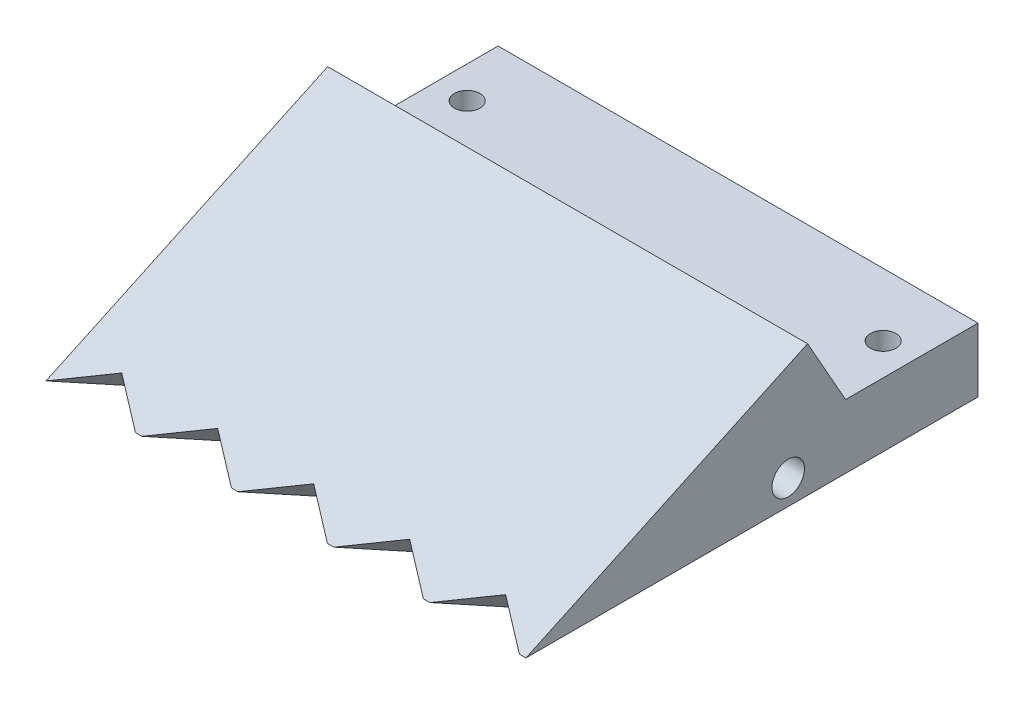
ISO-10303-21;
HEADER;
FILE_DESCRIPTION(('STEP AP214'),'2;1');
FILE_NAME('part.step','',(''),(''),'','','');
FILE_SCHEMA(('AUTOMOTIVE_DESIGN { 1 0 10303 214 1 1 1 1 }'));
ENDSEC;
DATA;
#1=APPLICATION_CONTEXT('core data for automotive mechanical design processes');
#2=APPLICATION_PROTOCOL_DEFINITION('international standard','automotive_design',2000,#1);
#3=PRODUCT_CONTEXT('',#1,'mechanical');
#4=PRODUCT('Part','Part','',(#3));
#5=PRODUCT_RELATED_PRODUCT_CATEGORY('part','',(#4));
#6=PRODUCT_DEFINITION_FORMATION('','',#4);
#7=PRODUCT_DEFINITION_CONTEXT('part definition',#1,'design');
#8=PRODUCT_DEFINITION('design','',#6,#7);
#9=PRODUCT_DEFINITION_SHAPE('','',#8);
#10=(LENGTH_UNIT() NAMED_UNIT(*) SI_UNIT(.MILLI.,.METRE.));
#11=(NAMED_UNIT(*) PLANE_ANGLE_UNIT() SI_UNIT($,.RADIAN.));
#12=(NAMED_UNIT(*) SI_UNIT($,.STERADIAN.) SOLID_ANGLE_UNIT());
#13=UNCERTAINTY_MEASURE_WITH_UNIT(LENGTH_MEASURE(1.E-05),#10,'distance_accuracy_value','');
#14=(GEOMETRIC_REPRESENTATION_CONTEXT(3) GLOBAL_UNCERTAINTY_ASSIGNED_CONTEXT((#13)) GLOBAL_UNIT_ASSIGNED_CONTEXT((#10,
#11,#12)) REPRESENTATION_CONTEXT('',''));
#15=CARTESIAN_POINT('',(0.,0.,0.));
#16=DIRECTION('',(0.,0.,1.));
#17=DIRECTION('',(1.,0.,0.));
#18=AXIS2_PLACEMENT_3D('',#15,#16,#17);
#19=CARTESIAN_POINT('',(75.,24.6994464564003,-8.57109619459907));
#20=DIRECTION('',(0.,-0.906307787036653,-0.422618261740694));
#21=DIRECTION('',(0.,0.422618261740694,-0.906307787036653));
#22=AXIS2_PLACEMENT_3D('',#19,#20,#21);
#23=PLANE('',#22);
#24=DIRECTION('',(0.,-0.422618261740694,0.906307787036653));
#25=VECTOR('',#24,1.);
#26=CARTESIAN_POINT('',(0.,24.6994464564003,-8.57109619459907));
#27=LINE('',#26,#25);
#28=CARTESIAN_POINT('',(0.,24.6994464564003,-8.57109619459907));
#29=VERTEX_POINT('',#28);
#30=CARTESIAN_POINT('',(0.,4.17318887122065,35.4476052489812));
#31=VERTEX_POINT('',#30);
#32=EDGE_CURVE('E220',#29,#31,#27,.T.);
#33=ORIENTED_EDGE('',*,*,#32,.T.);
#34=DIRECTION('',(-0.802159031205732,-0.25234978014748,0.541165849915346));
#35=VECTOR('',#34,1.);
#36=CARTESIAN_POINT('',(0.,4.17318887122065,35.4476052489812));
#37=LINE('',#36,#35);
#38=CARTESIAN_POINT('',(7.06585008190916,6.39602205686052,30.6807240992381));
#39=VERTEX_POINT('',#38);
#40=EDGE_CURVE('E152',#39,#31,#37,.T.);
#41=ORIENTED_EDGE('',*,*,#40,.F.);
#42=DIRECTION('',(-0.795744215045441,0.255951500653194,-0.548889764465591));
#43=VECTOR('',#42,1.);
#44=CARTESIAN_POINT('',(7.06585008190916,6.39602205686052,30.6807240992381));
#45=LINE('',#44,#43);
#46=CARTESIAN_POINT('',(13.9765602905617,4.17318887122065,35.4476052489812));
#47=VERTEX_POINT('',#46);
#48=EDGE_CURVE('E139',#47,#39,#45,.T.);
#49=ORIENTED_EDGE('',*,*,#48,.F.);
#50=DIRECTION('',(-1.,0.,0.));
#51=VECTOR('',#50,1.);
#52=CARTESIAN_POINT('',(75.,4.17318887122065,35.4476052489812));
#53=LINE('',#52,#51);
#54=CARTESIAN_POINT('',(15.,4.17318887122073,35.447605248981));
#55=VERTEX_POINT('',#54);
#56=EDGE_CURVE('E151',#55,#47,#53,.T.);
#57=ORIENTED_EDGE('',*,*,#56,.F.);
#58=DIRECTION('',(-0.802159031205732,-0.252349780147481,0.541165849915346));
#59=VECTOR('',#58,1.);
#60=CARTESIAN_POINT('',(15.,4.17318887122073,35.447605248981));
#61=LINE('',#60,#59);
#62=CARTESIAN_POINT('',(22.0658500819091,6.39602205686061,30.6807240992379));
#63=VERTEX_POINT('',#62);
#64=EDGE_CURVE('E380',#63,#55,#61,.T.);
#65=ORIENTED_EDGE('',*,*,#64,.F.);
#66=DIRECTION('',(-0.795744215045442,0.255951500653195,-0.548889764465591));
#67=VECTOR('',#66,1.);
#68=CARTESIAN_POINT('',(22.0658500819091,6.39602205686061,30.6807240992379));
#69=LINE('',#68,#67);
#70=CARTESIAN_POINT('',(28.9765602905617,4.17318887122073,35.447605248981));
#71=VERTEX_POINT('',#70);
#72=EDGE_CURVE('E204',#71,#63,#69,.T.);
#73=ORIENTED_EDGE('',*,*,#72,.F.);
#74=CARTESIAN_POINT('',(30.,4.17318887122082,35.4476052489808));
#75=VERTEX_POINT('',#74);
#76=EDGE_CURVE('E157',#75,#71,#53,.T.);
#77=ORIENTED_EDGE('',*,*,#76,.F.);
#78=DIRECTION('',(-0.802159031205732,-0.25234978014748,0.541165849915346));
#79=VECTOR('',#78,1.);
#80=CARTESIAN_POINT('',(30.,4.17318887122082,35.4476052489808));
#81=LINE('',#80,#79);
#82=CARTESIAN_POINT('',(37.0658500819091,6.3960220568607,30.6807240992377));
#83=VERTEX_POINT('',#82);
#84=EDGE_CURVE('E193',#83,#75,#81,.T.);
#85=ORIENTED_EDGE('',*,*,#84,.F.);
#86=DIRECTION('',(-0.795744215045442,0.255951500653194,-0.548889764465591));
#87=VECTOR('',#86,1.);
#88=CARTESIAN_POINT('',(37.0658500819091,6.3960220568607,30.6807240992377));
#89=LINE('',#88,#87);
#90=CARTESIAN_POINT('',(43.9765602905617,4.17318887122082,35.4476052489808));
#91=VERTEX_POINT('',#90);
#92=EDGE_CURVE('E191',#91,#83,#89,.T.);
#93=ORIENTED_EDGE('',*,*,#92,.F.);
#94=CARTESIAN_POINT('',(45.,4.17318887122091,35.4476052489806));
#95=VERTEX_POINT('',#94);
#96=EDGE_CURVE('E162',#95,#91,#53,.T.);
#97=ORIENTED_EDGE('',*,*,#96,.F.);
#98=DIRECTION('',(-0.802159031205732,-0.25234978014748,0.541165849915346));
#99=VECTOR('',#98,1.);
#100=CARTESIAN_POINT('',(45.,4.17318887122091,35.4476052489806));
#101=LINE('',#100,#99);
#102=CARTESIAN_POINT('',(52.0658500819091,6.39602205686078,30.6807240992375));
#103=VERTEX_POINT('',#102);
#104=EDGE_CURVE('E188',#103,#95,#101,.T.);
#105=ORIENTED_EDGE('',*,*,#104,.F.);
#106=DIRECTION('',(-0.795744215045442,0.255951500653194,-0.548889764465591));
#107=VECTOR('',#106,1.);
#108=CARTESIAN_POINT('',(52.0658500819091,6.39602205686078,30.6807240992375));
#109=LINE('',#108,#107);
#110=CARTESIAN_POINT('',(58.9765602905616,4.17318887122091,35.4476052489806));
#111=VERTEX_POINT('',#110);
#112=EDGE_CURVE('E205',#111,#103,#109,.T.);
#113=ORIENTED_EDGE('',*,*,#112,.F.);
#114=CARTESIAN_POINT('',(60.,4.173188871221,35.4476052489804));
#115=VERTEX_POINT('',#114);
#116=EDGE_CURVE('E169',#115,#111,#53,.T.);
#117=ORIENTED_EDGE('',*,*,#116,.F.);
#118=DIRECTION('',(-0.802159031205732,-0.25234978014748,0.541165849915346));
#119=VECTOR('',#118,1.);
#120=CARTESIAN_POINT('',(60.,4.173188871221,35.4476052489804));
#121=LINE('',#120,#119);
#122=CARTESIAN_POINT('',(67.0658500819091,6.39602205686087,30.6807240992373));
#123=VERTEX_POINT('',#122);
#124=EDGE_CURVE('E213',#123,#115,#121,.T.);
#125=ORIENTED_EDGE('',*,*,#124,.F.);
#126=DIRECTION('',(-0.795744215045442,0.255951500653194,-0.548889764465591));
#127=VECTOR('',#126,1.);
#128=CARTESIAN_POINT('',(67.0658500819091,6.39602205686087,30.6807240992373));
#129=LINE('',#128,#127);
#130=CARTESIAN_POINT('',(73.9765602905616,4.173188871221,35.4476052489804));
#131=VERTEX_POINT('',#130);
#132=EDGE_CURVE('E210',#131,#123,#129,.T.);
#133=ORIENTED_EDGE('',*,*,#132,.F.);
#134=CARTESIAN_POINT('',(75.,4.17318887122065,35.4476052489812));
#135=VERTEX_POINT('',#134);
#136=EDGE_CURVE('E160',#135,#131,#53,.T.);
#137=ORIENTED_EDGE('',*,*,#136,.F.);
#138=DIRECTION('',(0.,-0.422618261740694,0.906307787036653));
#139=VECTOR('',#138,1.);
#140=CARTESIAN_POINT('',(75.,24.6994464564003,-8.57109619459907));
#141=LINE('',#140,#139);
#142=CARTESIAN_POINT('',(75.,24.6994464564003,-8.57109619459907));
#143=VERTEX_POINT('',#142);
#144=EDGE_CURVE('E224',#143,#135,#141,.T.);
#145=ORIENTED_EDGE('',*,*,#144,.F.);
#146=DIRECTION('',(-1.,0.,0.));
#147=VECTOR('',#146,1.);
#148=CARTESIAN_POINT('',(75.,24.6994464564003,-8.57109619459907));
#149=LINE('',#148,#147);
#150=EDGE_CURVE('E236',#143,#29,#149,.T.);
#151=ORIENTED_EDGE('',*,*,#150,.T.);
#152=EDGE_LOOP('',(#33,#41,#49,#57,#65,#73,#77,#85,#93,#97,#105,#113,#117,#125,#133,#137,#145,#151));
#153=FACE_BOUND('',#152,.T.);
#154=ADVANCED_FACE('F34',(#153),#23,.F.);
#155=CARTESIAN_POINT('',(75.,4.17318887122065,35.4476052489812));
#156=DIRECTION('',(0.,1.,0.));
#157=DIRECTION('',(0.,0.,1.));
#158=AXIS2_PLACEMENT_3D('',#155,#156,#157);
#159=PLANE('',#158);
#160=CARTESIAN_POINT('',(69.9999989548679,4.17318887122065,-25.3862154796132));
#161=DIRECTION('',(0.,1.,0.));
#162=DIRECTION('',(0.,0.,1.));
#163=AXIS2_PLACEMENT_3D('',#160,#161,#162);
#164=CIRCLE('',#163,3.99999999999999);
#165=CARTESIAN_POINT('',(69.9999989548679,4.17318887122065,-21.3862154796132));
#166=VERTEX_POINT('',#165);
#167=EDGE_CURVE('E279',#166,#166,#164,.T.);
#168=ORIENTED_EDGE('',*,*,#167,.T.);
#169=EDGE_LOOP('',(#168));
#170=FACE_BOUND('',#169,.T.);
#171=CARTESIAN_POINT('',(5.,4.17318887122065,-25.3745592722076));
#172=DIRECTION('',(0.,1.,0.));
#173=DIRECTION('',(0.,0.,1.));
#174=AXIS2_PLACEMENT_3D('',#171,#172,#173);
#175=CIRCLE('',#174,3.99999999999999);
#176=CARTESIAN_POINT('',(5.,4.17318887122065,-21.3745592722076));
#177=VERTEX_POINT('',#176);
#178=EDGE_CURVE('E276',#177,#177,#175,.T.);
#179=ORIENTED_EDGE('',*,*,#178,.T.);
#180=EDGE_LOOP('',(#179));
#181=FACE_BOUND('',#180,.T.);
#182=DIRECTION('',(-0.765791701632656,0.,-0.643088695057347));
#183=VECTOR('',#182,1.);
#184=CARTESIAN_POINT('',(49.7629589494673,4.17318887122065,65.4999398006517));
#185=LINE('',#184,#183);
#186=CARTESIAN_POINT('',(7.06585008190916,4.17318887122065,29.6441999619731));
#187=VERTEX_POINT('',#186);
#188=EDGE_CURVE('E136',#47,#187,#185,.T.);
#189=ORIENTED_EDGE('',*,*,#188,.T.);
#190=DIRECTION('',(-0.772763043523777,0.,0.634694634106724));
#191=VECTOR('',#190,1.);
#192=CARTESIAN_POINT('',(44.7872041077098,4.17318887122065,-1.33753653805802));
#193=LINE('',#192,#191);
#194=EDGE_CURVE('E144',#187,#31,#193,.T.);
#195=ORIENTED_EDGE('',*,*,#194,.T.);
#196=DIRECTION('',(0.,0.,-1.));
#197=VECTOR('',#196,1.);
#198=CARTESIAN_POINT('',(0.,4.17318887122065,35.4476052489812));
#199=LINE('',#198,#197);
#200=CARTESIAN_POINT('',(0.,4.17318887122065,-35.2064814814815));
#201=VERTEX_POINT('',#200);
#202=EDGE_CURVE('E238',#31,#201,#199,.T.);
#203=ORIENTED_EDGE('',*,*,#202,.T.);
#204=DIRECTION('',(-1.,0.,0.));
#205=VECTOR('',#204,1.);
#206=CARTESIAN_POINT('',(75.,4.17318887122065,-35.2064814814815));
#207=LINE('',#206,#205);
#208=CARTESIAN_POINT('',(75.,4.17318887122065,-35.2064814814815));
#209=VERTEX_POINT('',#208);
#210=EDGE_CURVE('E158',#209,#201,#207,.T.);
#211=ORIENTED_EDGE('',*,*,#210,.F.);
#212=DIRECTION('',(0.,0.,-1.));
#213=VECTOR('',#212,1.);
#214=CARTESIAN_POINT('',(75.,4.17318887122065,35.4476052489812));
#215=LINE('',#214,#213);
#216=EDGE_CURVE('E227',#135,#209,#215,.T.);
#217=ORIENTED_EDGE('',*,*,#216,.F.);
#218=ORIENTED_EDGE('',*,*,#136,.T.);
#219=DIRECTION('',(-0.765791701632656,0.,-0.643088695057347));
#220=VECTOR('',#219,1.);
#221=CARTESIAN_POINT('',(74.5767431321014,4.17318887122065,35.9516206353298));
#222=LINE('',#221,#220);
#223=CARTESIAN_POINT('',(67.0658500819091,4.17318887122065,29.6441999619722));
#224=VERTEX_POINT('',#223);
#225=EDGE_CURVE('E168',#131,#224,#222,.T.);
#226=ORIENTED_EDGE('',*,*,#225,.T.);
#227=DIRECTION('',(-0.772763043523777,0.,0.634694634106724));
#228=VECTOR('',#227,1.);
#229=CARTESIAN_POINT('',(68.9574408215415,4.17318887122065,28.0905768915728));
#230=LINE('',#229,#228);
#231=EDGE_CURVE('E172',#224,#115,#230,.T.);
#232=ORIENTED_EDGE('',*,*,#231,.T.);
#233=ORIENTED_EDGE('',*,*,#116,.T.);
#234=DIRECTION('',(-0.765791701632656,0.,-0.643088695057347));
#235=VECTOR('',#234,1.);
#236=CARTESIAN_POINT('',(68.3732970864429,4.17318887122065,43.3387004266603));
#237=LINE('',#236,#235);
#238=CARTESIAN_POINT('',(52.0658500819091,4.17318887122065,29.6441999619725));
#239=VERTEX_POINT('',#238);
#240=EDGE_CURVE('E390',#111,#239,#237,.T.);
#241=ORIENTED_EDGE('',*,*,#240,.T.);
#242=DIRECTION('',(-0.772763043523777,0.,0.634694634106724));
#243=VECTOR('',#242,1.);
#244=CARTESIAN_POINT('',(62.9148816430836,4.17318887122065,20.7335485341651));
#245=LINE('',#244,#243);
#246=EDGE_CURVE('E184',#239,#95,#245,.T.);
#247=ORIENTED_EDGE('',*,*,#246,.T.);
#248=ORIENTED_EDGE('',*,*,#96,.T.);
#249=DIRECTION('',(-0.765791701632656,0.,-0.643088695057347));
#250=VECTOR('',#249,1.);
#251=CARTESIAN_POINT('',(62.1698510407844,4.17318887122065,50.7257802179907));
#252=LINE('',#251,#250);
#253=CARTESIAN_POINT('',(37.0658500819091,4.17318887122065,29.6441999619727));
#254=VERTEX_POINT('',#253);
#255=EDGE_CURVE('E182',#91,#254,#252,.T.);
#256=ORIENTED_EDGE('',*,*,#255,.T.);
#257=DIRECTION('',(-0.772763043523777,0.,0.634694634106724));
#258=VECTOR('',#257,1.);
#259=CARTESIAN_POINT('',(56.8723224646257,4.17318887122065,13.3765201767574));
#260=LINE('',#259,#258);
#261=EDGE_CURVE('E384',#254,#75,#260,.T.);
#262=ORIENTED_EDGE('',*,*,#261,.T.);
#263=ORIENTED_EDGE('',*,*,#76,.T.);
#264=DIRECTION('',(-0.765791701632656,0.,-0.643088695057347));
#265=VECTOR('',#264,1.);
#266=CARTESIAN_POINT('',(55.9664049951259,4.17318887122065,58.1128600093212));
#267=LINE('',#266,#265);
#268=CARTESIAN_POINT('',(22.0658500819091,4.17318887122065,29.6441999619729));
#269=VERTEX_POINT('',#268);
#270=EDGE_CURVE('E382',#71,#269,#267,.T.);
#271=ORIENTED_EDGE('',*,*,#270,.T.);
#272=DIRECTION('',(-0.772763043523778,0.,0.634694634106724));
#273=VECTOR('',#272,1.);
#274=CARTESIAN_POINT('',(50.8297632861678,4.17318887122065,6.01949181934968));
#275=LINE('',#274,#273);
#276=EDGE_CURVE('E145',#269,#55,#275,.T.);
#277=ORIENTED_EDGE('',*,*,#276,.T.);
#278=ORIENTED_EDGE('',*,*,#56,.T.);
#279=EDGE_LOOP('',(#189,#195,#203,#211,#217,#218,#226,#232,#233,#241,#247,#248,#256,#262,#263,
#271,#277,#278));
#280=FACE_BOUND('',#279,.T.);
#281=ADVANCED_FACE('F155',(#170,#181,#280),#159,.F.);
#282=CARTESIAN_POINT('',(75.,4.17318887122065,-35.2064814814815));
#283=DIRECTION('',(0.,0.,1.));
#284=DIRECTION('',(1.,0.,0.));
#285=AXIS2_PLACEMENT_3D('',#282,#283,#284);
#286=PLANE('',#285);
#287=DIRECTION('',(0.,1.,0.));
#288=VECTOR('',#287,1.);
#289=CARTESIAN_POINT('',(0.,4.17318887122065,-35.2064814814815));
#290=LINE('',#289,#288);
#291=CARTESIAN_POINT('',(0.,14.1731888712206,-35.2064814814815));
#292=VERTEX_POINT('',#291);
#293=EDGE_CURVE('E240',#201,#292,#290,.T.);
#294=ORIENTED_EDGE('',*,*,#293,.T.);
#295=DIRECTION('',(-1.,0.,0.));
#296=VECTOR('',#295,1.);
#297=CARTESIAN_POINT('',(75.,14.1731888712206,-35.2064814814815));
#298=LINE('',#297,#296);
#299=CARTESIAN_POINT('',(75.,14.1731888712206,-35.2064814814815));
#300=VERTEX_POINT('',#299);
#301=EDGE_CURVE('E164',#300,#292,#298,.T.);
#302=ORIENTED_EDGE('',*,*,#301,.F.);
#303=DIRECTION('',(0.,1.,0.));
#304=VECTOR('',#303,1.);
#305=CARTESIAN_POINT('',(75.,4.17318887122065,-35.2064814814815));
#306=LINE('',#305,#304);
#307=EDGE_CURVE('E230',#209,#300,#306,.T.);
#308=ORIENTED_EDGE('',*,*,#307,.F.);
#309=ORIENTED_EDGE('',*,*,#210,.T.);
#310=EDGE_LOOP('',(#294,#302,#308,#309));
#311=FACE_BOUND('',#310,.T.);
#312=ADVANCED_FACE('F274',(#311),#286,.F.);
#313=CARTESIAN_POINT('',(75.,14.1731888712206,-35.2064814814815));
#314=DIRECTION('',(0.,-1.,0.));
#315=DIRECTION('',(0.,0.,-1.));
#316=AXIS2_PLACEMENT_3D('',#313,#314,#315);
#317=PLANE('',#316);
#318=CARTESIAN_POINT('',(5.,14.1731888712206,-25.3745592722076));
#319=DIRECTION('',(0.,1.,0.));
#320=DIRECTION('',(0.,0.,1.));
#321=AXIS2_PLACEMENT_3D('',#318,#319,#320);
#322=CIRCLE('',#321,2.);
#323=CARTESIAN_POINT('',(5.,14.1731888712206,-23.3745592722076));
#324=VERTEX_POINT('',#323);
#325=EDGE_CURVE('E217',#324,#324,#322,.T.);
#326=ORIENTED_EDGE('',*,*,#325,.F.);
#327=EDGE_LOOP('',(#326));
#328=FACE_BOUND('',#327,.T.);
#329=CARTESIAN_POINT('',(69.9999989548679,14.1731888712206,-25.3862154796132));
#330=DIRECTION('',(0.,1.,0.));
#331=DIRECTION('',(0.,0.,1.));
#332=AXIS2_PLACEMENT_3D('',#329,#330,#331);
#333=CIRCLE('',#332,2.);
#334=CARTESIAN_POINT('',(69.9999989548679,14.1731888712206,-23.3862154796132));
#335=VERTEX_POINT('',#334);
#336=EDGE_CURVE('E221',#335,#335,#333,.T.);
#337=ORIENTED_EDGE('',*,*,#336,.F.);
#338=EDGE_LOOP('',(#337));
#339=FACE_BOUND('',#338,.T.);
#340=DIRECTION('',(0.,0.,1.));
#341=VECTOR('',#340,1.);
#342=CARTESIAN_POINT('',(0.,14.1731888712206,-35.2064814814815));
#343=LINE('',#342,#341);
#344=CARTESIAN_POINT('',(0.,14.1731888712206,-14.5119108644451));
#345=VERTEX_POINT('',#344);
#346=EDGE_CURVE('E242',#292,#345,#343,.T.);
#347=ORIENTED_EDGE('',*,*,#346,.T.);
#348=DIRECTION('',(-1.,0.,0.));
#349=VECTOR('',#348,1.);
#350=CARTESIAN_POINT('',(75.,14.1731888712206,-14.5119108644451));
#351=LINE('',#350,#349);
#352=CARTESIAN_POINT('',(75.,14.1731888712206,-14.5119108644451));
#353=VERTEX_POINT('',#352);
#354=EDGE_CURVE('E247',#353,#345,#351,.T.);
#355=ORIENTED_EDGE('',*,*,#354,.F.);
#356=DIRECTION('',(0.,0.,1.));
#357=VECTOR('',#356,1.);
#358=CARTESIAN_POINT('',(75.,14.1731888712206,-35.2064814814815));
#359=LINE('',#358,#357);
#360=EDGE_CURVE('E232',#300,#353,#359,.T.);
#361=ORIENTED_EDGE('',*,*,#360,.F.);
#362=ORIENTED_EDGE('',*,*,#301,.T.);
#363=EDGE_LOOP('',(#347,#355,#361,#362));
#364=FACE_BOUND('',#363,.T.);
#365=ADVANCED_FACE('F255',(#328,#339,#364),#317,.F.);
#366=CARTESIAN_POINT('',(75.,14.1731888712206,-14.5119108644451));
#367=DIRECTION('',(0.,-0.491504803469351,0.870874863666735));
#368=DIRECTION('',(0.,-0.870874863666736,-0.491504803469351));
#369=AXIS2_PLACEMENT_3D('',#366,#367,#368);
#370=PLANE('',#369);
#371=DIRECTION('',(0.,0.870874863666735,0.491504803469351));
#372=VECTOR('',#371,1.);
#373=CARTESIAN_POINT('',(0.,14.1731888712206,-14.5119108644451));
#374=LINE('',#373,#372);
#375=EDGE_CURVE('E228',#345,#29,#374,.T.);
#376=ORIENTED_EDGE('',*,*,#375,.T.);
#377=ORIENTED_EDGE('',*,*,#150,.F.);
#378=DIRECTION('',(0.,0.870874863666735,0.491504803469351));
#379=VECTOR('',#378,1.);
#380=CARTESIAN_POINT('',(75.,14.1731888712206,-14.5119108644451));
#381=LINE('',#380,#379);
#382=EDGE_CURVE('E234',#353,#143,#381,.T.);
#383=ORIENTED_EDGE('',*,*,#382,.F.);
#384=ORIENTED_EDGE('',*,*,#354,.T.);
#385=EDGE_LOOP('',(#376,#377,#383,#384));
#386=FACE_BOUND('',#385,.T.);
#387=ADVANCED_FACE('F267',(#386),#370,.F.);
#388=CARTESIAN_POINT('',(75.,0.,0.));
#389=DIRECTION('',(-1.,0.,0.));
#390=DIRECTION('',(0.,0.,1.));
#391=AXIS2_PLACEMENT_3D('',#388,#389,#390);
#392=PLANE('',#391);
#393=CARTESIAN_POINT('',(75.,8.033515634858,-5.54758710562415));
#394=DIRECTION('',(-1.,0.,0.));
#395=DIRECTION('',(0.,0.,1.));
#396=AXIS2_PLACEMENT_3D('',#393,#394,#395);
#397=CIRCLE('',#396,2.54300844368567);
#398=CARTESIAN_POINT('',(75.,8.033515634858,-3.00457866193848));
#399=VERTEX_POINT('',#398);
#400=EDGE_CURVE('E214',#399,#399,#397,.T.);
#401=ORIENTED_EDGE('',*,*,#400,.T.);
#402=EDGE_LOOP('',(#401));
#403=FACE_BOUND('',#402,.T.);
#404=ORIENTED_EDGE('',*,*,#144,.T.);
#405=ORIENTED_EDGE('',*,*,#216,.T.);
#406=ORIENTED_EDGE('',*,*,#307,.T.);
#407=ORIENTED_EDGE('',*,*,#360,.T.);
#408=ORIENTED_EDGE('',*,*,#382,.T.);
#409=EDGE_LOOP('',(#404,#405,#406,#407,#408));
#410=FACE_BOUND('',#409,.T.);
#411=ADVANCED_FACE('F272',(#403,#410),#392,.F.);
#412=CARTESIAN_POINT('',(0.,0.,0.));
#413=DIRECTION('',(-1.,0.,0.));
#414=DIRECTION('',(0.,0.,1.));
#415=AXIS2_PLACEMENT_3D('',#412,#413,#414);
#416=PLANE('',#415);
#417=CARTESIAN_POINT('',(0.,8.033515634858,-5.54758710562415));
#418=DIRECTION('',(-1.,0.,0.));
#419=DIRECTION('',(0.,0.,1.));
#420=AXIS2_PLACEMENT_3D('',#417,#418,#419);
#421=CIRCLE('',#420,2.54300844368567);
#422=CARTESIAN_POINT('',(0.,8.033515634858,-3.00457866193848));
#423=VERTEX_POINT('',#422);
#424=EDGE_CURVE('E372',#423,#423,#421,.T.);
#425=ORIENTED_EDGE('',*,*,#424,.F.);
#426=EDGE_LOOP('',(#425));
#427=FACE_BOUND('',#426,.T.);
#428=ORIENTED_EDGE('',*,*,#32,.F.);
#429=ORIENTED_EDGE('',*,*,#375,.F.);
#430=ORIENTED_EDGE('',*,*,#346,.F.);
#431=ORIENTED_EDGE('',*,*,#293,.F.);
#432=ORIENTED_EDGE('',*,*,#202,.F.);
#433=EDGE_LOOP('',(#428,#429,#430,#431,#432));
#434=FACE_BOUND('',#433,.T.);
#435=ADVANCED_FACE('F263',(#427,#434),#416,.T.);
#436=CARTESIAN_POINT('',(69.9999989548679,4.17318887122064,-25.3862154796132));
#437=DIRECTION('',(0.,1.,0.));
#438=DIRECTION('',(0.,0.,1.));
#439=AXIS2_PLACEMENT_3D('',#436,#437,#438);
#440=CYLINDRICAL_SURFACE('',#439,2.);
#441=CARTESIAN_POINT('',(69.9999989548679,6.17318887122064,-25.3862154796132));
#442=DIRECTION('',(0.,1.,0.));
#443=DIRECTION('',(0.,0.,1.));
#444=AXIS2_PLACEMENT_3D('',#441,#442,#443);
#445=CIRCLE('',#444,2.);
#446=CARTESIAN_POINT('',(69.9999989548679,6.17318887122064,-23.3862154796132));
#447=VERTEX_POINT('',#446);
#448=EDGE_CURVE('E42',#447,#447,#445,.F.);
#449=ORIENTED_EDGE('',*,*,#448,.T.);
#450=EDGE_LOOP('',(#449));
#451=FACE_BOUND('',#450,.T.);
#452=ORIENTED_EDGE('',*,*,#336,.T.);
#453=EDGE_LOOP('',(#452));
#454=FACE_BOUND('',#453,.T.);
#455=ADVANCED_FACE('F287',(#451,#454),#440,.F.);
#456=CARTESIAN_POINT('',(5.,4.17318887122064,-25.3745592722076));
#457=DIRECTION('',(0.,1.,0.));
#458=DIRECTION('',(0.,0.,1.));
#459=AXIS2_PLACEMENT_3D('',#456,#457,#458);
#460=CYLINDRICAL_SURFACE('',#459,2.);
#461=CARTESIAN_POINT('',(5.,6.17318887122064,-25.3745592722076));
#462=DIRECTION('',(0.,1.,0.));
#463=DIRECTION('',(0.,0.,1.));
#464=AXIS2_PLACEMENT_3D('',#461,#462,#463);
#465=CIRCLE('',#464,2.);
#466=CARTESIAN_POINT('',(5.,6.17318887122064,-23.3745592722076));
#467=VERTEX_POINT('',#466);
#468=EDGE_CURVE('E11',#467,#467,#465,.F.);
#469=ORIENTED_EDGE('',*,*,#468,.T.);
#470=EDGE_LOOP('',(#469));
#471=FACE_BOUND('',#470,.T.);
#472=ORIENTED_EDGE('',*,*,#325,.T.);
#473=EDGE_LOOP('',(#472));
#474=FACE_BOUND('',#473,.T.);
#475=ADVANCED_FACE('F326',(#471,#474),#460,.F.);
#476=CARTESIAN_POINT('',(60.,-4.88988899914553,31.2214226315735));
#477=DIRECTION('',(-0.597110449293161,0.339007055407765,-0.727002976423532));
#478=DIRECTION('',(-0.772763043523777,0.,0.634694634106724));
#479=AXIS2_PLACEMENT_3D('',#476,#477,#478);
#480=PLANE('',#479);
#481=DIRECTION('',(0.,0.906307787036653,0.422618261740694));
#482=VECTOR('',#481,1.);
#483=CARTESIAN_POINT('',(67.0658500819091,-2.66705581350565,26.4545414818304));
#484=LINE('',#483,#482);
#485=EDGE_CURVE('E208',#224,#123,#484,.T.);
#486=ORIENTED_EDGE('',*,*,#485,.T.);
#487=ORIENTED_EDGE('',*,*,#124,.T.);
#488=ORIENTED_EDGE('',*,*,#231,.F.);
#489=EDGE_LOOP('',(#486,#487,#488));
#490=FACE_BOUND('',#489,.T.);
#491=ADVANCED_FACE('F329',(#490),#480,.F.);
#492=CARTESIAN_POINT('',(67.0658500819091,-2.66705581350565,26.4545414818304));
#493=DIRECTION('',(0.605632846055854,0.336296036952717,-0.721189178585052));
#494=DIRECTION('',(-0.765791701632656,0.,-0.643088695057347));
#495=AXIS2_PLACEMENT_3D('',#492,#493,#494);
#496=PLANE('',#495);
#497=ORIENTED_EDGE('',*,*,#132,.T.);
#498=ORIENTED_EDGE('',*,*,#485,.F.);
#499=ORIENTED_EDGE('',*,*,#225,.F.);
#500=EDGE_LOOP('',(#497,#498,#499));
#501=FACE_BOUND('',#500,.T.);
#502=ADVANCED_FACE('F331',(#501),#496,.F.);
#503=CARTESIAN_POINT('',(45.,-4.88988899914562,31.2214226315737));
#504=DIRECTION('',(-0.597110449293161,0.339007055407765,-0.727002976423532));
#505=DIRECTION('',(-0.772763043523777,0.,0.634694634106724));
#506=AXIS2_PLACEMENT_3D('',#503,#504,#505);
#507=PLANE('',#506);
#508=DIRECTION('',(0.,0.906307787036653,0.422618261740694));
#509=VECTOR('',#508,1.);
#510=CARTESIAN_POINT('',(52.0658500819091,-2.66705581350574,26.4545414818306));
#511=LINE('',#510,#509);
#512=EDGE_CURVE('E195',#239,#103,#511,.T.);
#513=ORIENTED_EDGE('',*,*,#512,.T.);
#514=ORIENTED_EDGE('',*,*,#104,.T.);
#515=ORIENTED_EDGE('',*,*,#246,.F.);
#516=EDGE_LOOP('',(#513,#514,#515));
#517=FACE_BOUND('',#516,.T.);
#518=ADVANCED_FACE('F334',(#517),#507,.F.);
#519=CARTESIAN_POINT('',(52.0658500819091,-2.66705581350574,26.4545414818306));
#520=DIRECTION('',(0.605632846055854,0.336296036952717,-0.721189178585052));
#521=DIRECTION('',(-0.765791701632656,0.,-0.643088695057347));
#522=AXIS2_PLACEMENT_3D('',#519,#520,#521);
#523=PLANE('',#522);
#524=ORIENTED_EDGE('',*,*,#112,.T.);
#525=ORIENTED_EDGE('',*,*,#512,.F.);
#526=ORIENTED_EDGE('',*,*,#240,.F.);
#527=EDGE_LOOP('',(#524,#525,#526));
#528=FACE_BOUND('',#527,.T.);
#529=ADVANCED_FACE('F339',(#528),#523,.F.);
#530=CARTESIAN_POINT('',(30.,-4.88988899914571,31.2214226315739));
#531=DIRECTION('',(-0.597110449293161,0.339007055407765,-0.727002976423532));
#532=DIRECTION('',(-0.772763043523777,0.,0.634694634106724));
#533=AXIS2_PLACEMENT_3D('',#530,#531,#532);
#534=PLANE('',#533);
#535=DIRECTION('',(0.,0.906307787036653,0.422618261740694));
#536=VECTOR('',#535,1.);
#537=CARTESIAN_POINT('',(37.0658500819091,-2.66705581350583,26.4545414818308));
#538=LINE('',#537,#536);
#539=EDGE_CURVE('E197',#254,#83,#538,.T.);
#540=ORIENTED_EDGE('',*,*,#539,.T.);
#541=ORIENTED_EDGE('',*,*,#84,.T.);
#542=ORIENTED_EDGE('',*,*,#261,.F.);
#543=EDGE_LOOP('',(#540,#541,#542));
#544=FACE_BOUND('',#543,.T.);
#545=ADVANCED_FACE('F342',(#544),#534,.F.);
#546=CARTESIAN_POINT('',(37.0658500819091,-2.66705581350583,26.4545414818308));
#547=DIRECTION('',(0.605632846055854,0.336296036952717,-0.721189178585052));
#548=DIRECTION('',(-0.765791701632656,0.,-0.643088695057347));
#549=AXIS2_PLACEMENT_3D('',#546,#547,#548);
#550=PLANE('',#549);
#551=ORIENTED_EDGE('',*,*,#92,.T.);
#552=ORIENTED_EDGE('',*,*,#539,.F.);
#553=ORIENTED_EDGE('',*,*,#255,.F.);
#554=EDGE_LOOP('',(#551,#552,#553));
#555=FACE_BOUND('',#554,.T.);
#556=ADVANCED_FACE('F347',(#555),#550,.F.);
#557=CARTESIAN_POINT('',(15.,-4.8898889991458,31.221422631574));
#558=DIRECTION('',(-0.597110449293161,0.339007055407766,-0.727002976423533));
#559=DIRECTION('',(-0.772763043523778,0.,0.634694634106724));
#560=AXIS2_PLACEMENT_3D('',#557,#558,#559);
#561=PLANE('',#560);
#562=DIRECTION('',(0.,0.906307787036653,0.422618261740694));
#563=VECTOR('',#562,1.);
#564=CARTESIAN_POINT('',(22.0658500819091,-2.66705581350592,26.454541481831));
#565=LINE('',#564,#563);
#566=EDGE_CURVE('E57',#269,#63,#565,.T.);
#567=ORIENTED_EDGE('',*,*,#566,.T.);
#568=ORIENTED_EDGE('',*,*,#64,.T.);
#569=ORIENTED_EDGE('',*,*,#276,.F.);
#570=EDGE_LOOP('',(#567,#568,#569));
#571=FACE_BOUND('',#570,.T.);
#572=ADVANCED_FACE('F350',(#571),#561,.F.);
#573=CARTESIAN_POINT('',(22.0658500819091,-2.66705581350592,26.454541481831));
#574=DIRECTION('',(0.605632846055854,0.336296036952717,-0.721189178585052));
#575=DIRECTION('',(-0.765791701632656,0.,-0.643088695057347));
#576=AXIS2_PLACEMENT_3D('',#573,#574,#575);
#577=PLANE('',#576);
#578=ORIENTED_EDGE('',*,*,#72,.T.);
#579=ORIENTED_EDGE('',*,*,#566,.F.);
#580=ORIENTED_EDGE('',*,*,#270,.F.);
#581=EDGE_LOOP('',(#578,#579,#580));
#582=FACE_BOUND('',#581,.T.);
#583=ADVANCED_FACE('F354',(#582),#577,.F.);
#584=CARTESIAN_POINT('',(0.,-4.88988899914588,31.2214226315742));
#585=DIRECTION('',(-0.597110449293161,0.339007055407765,-0.727002976423532));
#586=DIRECTION('',(-0.772763043523777,0.,0.634694634106724));
#587=AXIS2_PLACEMENT_3D('',#584,#585,#586);
#588=PLANE('',#587);
#589=DIRECTION('',(0.,0.906307787036653,0.422618261740694));
#590=VECTOR('',#589,1.);
#591=CARTESIAN_POINT('',(7.06585008190916,-2.66705581350601,26.4545414818311));
#592=LINE('',#591,#590);
#593=EDGE_CURVE('E49',#187,#39,#592,.T.);
#594=ORIENTED_EDGE('',*,*,#593,.T.);
#595=ORIENTED_EDGE('',*,*,#40,.T.);
#596=ORIENTED_EDGE('',*,*,#194,.F.);
#597=EDGE_LOOP('',(#594,#595,#596));
#598=FACE_BOUND('',#597,.T.);
#599=ADVANCED_FACE('F357',(#598),#588,.F.);
#600=CARTESIAN_POINT('',(7.06585008190916,-2.66705581350601,26.4545414818311));
#601=DIRECTION('',(0.605632846055855,0.336296036952717,-0.721189178585052));
#602=DIRECTION('',(-0.765791701632656,0.,-0.643088695057347));
#603=AXIS2_PLACEMENT_3D('',#600,#601,#602);
#604=PLANE('',#603);
#605=ORIENTED_EDGE('',*,*,#48,.T.);
#606=ORIENTED_EDGE('',*,*,#593,.F.);
#607=ORIENTED_EDGE('',*,*,#188,.F.);
#608=EDGE_LOOP('',(#605,#606,#607));
#609=FACE_BOUND('',#608,.T.);
#610=ADVANCED_FACE('F138',(#609),#604,.F.);
#611=CARTESIAN_POINT('',(100.,8.033515634858,-5.54758710562415));
#612=DIRECTION('',(-1.,0.,0.));
#613=DIRECTION('',(0.,0.,1.));
#614=AXIS2_PLACEMENT_3D('',#611,#612,#613);
#615=CYLINDRICAL_SURFACE('',#614,2.54300844368567);
#616=ORIENTED_EDGE('',*,*,#424,.T.);
#617=EDGE_LOOP('',(#616));
#618=FACE_BOUND('',#617,.T.);
#619=ORIENTED_EDGE('',*,*,#400,.F.);
#620=EDGE_LOOP('',(#619));
#621=FACE_BOUND('',#620,.T.);
#622=ADVANCED_FACE('F293',(#618,#621),#615,.F.);
#623=CARTESIAN_POINT('',(69.9999989548679,4.17318887122065,-25.3862154796132));
#624=DIRECTION('',(0.,-1.,0.));
#625=DIRECTION('',(0.,0.,-1.));
#626=AXIS2_PLACEMENT_3D('',#623,#624,#625);
#627=CONICAL_SURFACE('',#626,3.99999999999999,0.785398163397447);
#628=ORIENTED_EDGE('',*,*,#448,.F.);
#629=EDGE_LOOP('',(#628));
#630=FACE_BOUND('',#629,.T.);
#631=ORIENTED_EDGE('',*,*,#167,.F.);
#632=EDGE_LOOP('',(#631));
#633=FACE_BOUND('',#632,.T.);
#634=ADVANCED_FACE('F290',(#630,#633),#627,.F.);
#635=CARTESIAN_POINT('',(5.,4.17318887122065,-25.3745592722076));
#636=DIRECTION('',(0.,-1.,0.));
#637=DIRECTION('',(0.,0.,-1.));
#638=AXIS2_PLACEMENT_3D('',#635,#636,#637);
#639=CONICAL_SURFACE('',#638,3.99999999999999,0.785398163397447);
#640=ORIENTED_EDGE('',*,*,#468,.F.);
#641=EDGE_LOOP('',(#640));
#642=FACE_BOUND('',#641,.T.);
#643=ORIENTED_EDGE('',*,*,#178,.F.);
#644=EDGE_LOOP('',(#643));
#645=FACE_BOUND('',#644,.T.);
#646=ADVANCED_FACE('F36',(#642,#645),#639,.F.);
#647=CLOSED_SHELL('',(#154,#281,#312,#365,#387,#411,#435,#455,#475,#491,#502,#518,#529,#545,
#556,#572,#583,#599,#610,#622,#634,#646));
#648=MANIFOLD_SOLID_BREP('B2',#647);
#649=ADVANCED_BREP_SHAPE_REPRESENTATION('',(#18,#648),#14);
#650=SHAPE_DEFINITION_REPRESENTATION(#9,#649);
ENDSEC;
END-ISO-10303-21;
